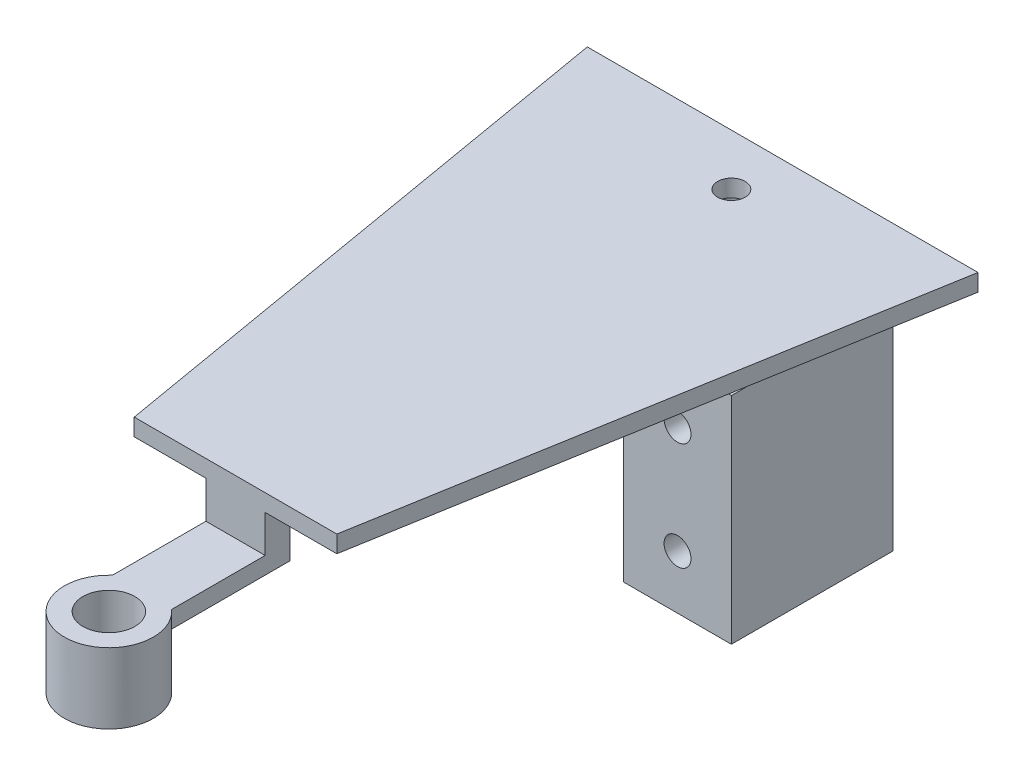
ISO-10303-21;
HEADER;
FILE_DESCRIPTION(('STEP AP214'),'2;1');
FILE_NAME('part.step','',(''),(''),'','','');
FILE_SCHEMA(('AUTOMOTIVE_DESIGN { 1 0 10303 214 1 1 1 1 }'));
ENDSEC;
DATA;
#1=APPLICATION_CONTEXT('core data for automotive mechanical design processes');
#2=APPLICATION_PROTOCOL_DEFINITION('international standard','automotive_design',2000,#1);
#3=PRODUCT_CONTEXT('',#1,'mechanical');
#4=PRODUCT('Part','Part','',(#3));
#5=PRODUCT_RELATED_PRODUCT_CATEGORY('part','',(#4));
#6=PRODUCT_DEFINITION_FORMATION('','',#4);
#7=PRODUCT_DEFINITION_CONTEXT('part definition',#1,'design');
#8=PRODUCT_DEFINITION('design','',#6,#7);
#9=PRODUCT_DEFINITION_SHAPE('','',#8);
#10=(LENGTH_UNIT() NAMED_UNIT(*) SI_UNIT(.MILLI.,.METRE.));
#11=(NAMED_UNIT(*) PLANE_ANGLE_UNIT() SI_UNIT($,.RADIAN.));
#12=(NAMED_UNIT(*) SI_UNIT($,.STERADIAN.) SOLID_ANGLE_UNIT());
#13=UNCERTAINTY_MEASURE_WITH_UNIT(LENGTH_MEASURE(1.E-05),#10,'distance_accuracy_value','');
#14=(GEOMETRIC_REPRESENTATION_CONTEXT(3) GLOBAL_UNCERTAINTY_ASSIGNED_CONTEXT((#13)) GLOBAL_UNIT_ASSIGNED_CONTEXT((#10,
#11,#12)) REPRESENTATION_CONTEXT('',''));
#15=CARTESIAN_POINT('',(0.,0.,0.));
#16=DIRECTION('',(0.,0.,1.));
#17=DIRECTION('',(1.,0.,0.));
#18=AXIS2_PLACEMENT_3D('',#15,#16,#17);
#19=CARTESIAN_POINT('',(10.,53.081,105.6));
#20=DIRECTION('',(0.,1.,0.));
#21=DIRECTION('',(0.,0.,1.));
#22=AXIS2_PLACEMENT_3D('',#19,#20,#21);
#23=PLANE('',#22);
#24=DIRECTION('',(1.,0.,0.));
#25=VECTOR('',#24,1.);
#26=CARTESIAN_POINT('',(4.5,53.081,82.075));
#27=LINE('',#26,#25);
#28=CARTESIAN_POINT('',(4.50000000000001,53.081,82.075));
#29=VERTEX_POINT('',#28);
#30=CARTESIAN_POINT('',(15.5,53.081,82.075));
#31=VERTEX_POINT('',#30);
#32=EDGE_CURVE('E64',#29,#31,#27,.T.);
#33=ORIENTED_EDGE('',*,*,#32,.F.);
#34=DIRECTION('',(0.,0.,1.));
#35=VECTOR('',#34,1.);
#36=CARTESIAN_POINT('',(4.50000000000001,53.081,99.4441064824024));
#37=LINE('',#36,#35);
#38=CARTESIAN_POINT('',(4.50000000000001,53.081,99.4441064824024));
#39=VERTEX_POINT('',#38);
#40=EDGE_CURVE('E68',#29,#39,#37,.T.);
#41=ORIENTED_EDGE('',*,*,#40,.T.);
#42=CARTESIAN_POINT('',(10.,53.081,105.6));
#43=DIRECTION('',(0.,1.,0.));
#44=DIRECTION('',(0.,0.,1.));
#45=AXIS2_PLACEMENT_3D('',#42,#43,#44);
#46=CIRCLE('',#45,8.255);
#47=CARTESIAN_POINT('',(15.5,53.081,99.4441064824024));
#48=VERTEX_POINT('',#47);
#49=EDGE_CURVE('E57',#39,#48,#46,.T.);
#50=ORIENTED_EDGE('',*,*,#49,.T.);
#51=DIRECTION('',(0.,0.,-1.));
#52=VECTOR('',#51,1.);
#53=CARTESIAN_POINT('',(15.5,53.081,99.4441064824024));
#54=LINE('',#53,#52);
#55=EDGE_CURVE('E192',#48,#31,#54,.T.);
#56=ORIENTED_EDGE('',*,*,#55,.T.);
#57=EDGE_LOOP('',(#33,#41,#50,#56));
#58=FACE_BOUND('',#57,.T.);
#59=CARTESIAN_POINT('',(10.,53.081,105.6));
#60=DIRECTION('',(0.,1.,0.));
#61=DIRECTION('',(0.,0.,1.));
#62=AXIS2_PLACEMENT_3D('',#59,#60,#61);
#63=CIRCLE('',#62,4.82599999999999);
#64=CARTESIAN_POINT('',(10.,53.081,110.426));
#65=VERTEX_POINT('',#64);
#66=EDGE_CURVE('E211',#65,#65,#63,.T.);
#67=ORIENTED_EDGE('',*,*,#66,.F.);
#68=EDGE_LOOP('',(#67));
#69=FACE_BOUND('',#68,.T.);
#70=ADVANCED_FACE('F49',(#58,#69),#23,.T.);
#71=CARTESIAN_POINT('',(10.,40.,105.6));
#72=DIRECTION('',(0.,1.,0.));
#73=DIRECTION('',(0.,0.,1.));
#74=AXIS2_PLACEMENT_3D('',#71,#72,#73);
#75=PLANE('',#74);
#76=CARTESIAN_POINT('',(10.,40.,105.6));
#77=DIRECTION('',(0.,1.,0.));
#78=DIRECTION('',(0.,0.,1.));
#79=AXIS2_PLACEMENT_3D('',#76,#77,#78);
#80=CIRCLE('',#79,8.255);
#81=CARTESIAN_POINT('',(10.,40.,113.855));
#82=VERTEX_POINT('',#81);
#83=EDGE_CURVE('E214',#82,#82,#80,.T.);
#84=ORIENTED_EDGE('',*,*,#83,.F.);
#85=EDGE_LOOP('',(#84));
#86=FACE_BOUND('',#85,.T.);
#87=CARTESIAN_POINT('',(10.,40.,105.6));
#88=DIRECTION('',(0.,1.,0.));
#89=DIRECTION('',(0.,0.,1.));
#90=AXIS2_PLACEMENT_3D('',#87,#88,#89);
#91=CIRCLE('',#90,4.82599999999999);
#92=CARTESIAN_POINT('',(10.,40.,110.426));
#93=VERTEX_POINT('',#92);
#94=EDGE_CURVE('E203',#93,#93,#91,.T.);
#95=ORIENTED_EDGE('',*,*,#94,.T.);
#96=EDGE_LOOP('',(#95));
#97=FACE_BOUND('',#96,.T.);
#98=ADVANCED_FACE('F221',(#86,#97),#75,.F.);
#99=CARTESIAN_POINT('',(10.,53.081,105.6));
#100=DIRECTION('',(0.,-1.,0.));
#101=DIRECTION('',(0.,0.,-1.));
#102=AXIS2_PLACEMENT_3D('',#99,#100,#101);
#103=CYLINDRICAL_SURFACE('',#102,8.255);
#104=ORIENTED_EDGE('',*,*,#49,.F.);
#105=DIRECTION('',(0.,1.,0.));
#106=VECTOR('',#105,1.);
#107=CARTESIAN_POINT('',(4.50000000000001,49.906,99.4441064824024));
#108=LINE('',#107,#106);
#109=CARTESIAN_POINT('',(4.50000000000001,49.906,99.4441064824024));
#110=VERTEX_POINT('',#109);
#111=EDGE_CURVE('E198',#110,#39,#108,.T.);
#112=ORIENTED_EDGE('',*,*,#111,.F.);
#113=CARTESIAN_POINT('',(10.,49.906,105.6));
#114=DIRECTION('',(0.,-1.,0.));
#115=DIRECTION('',(0.,0.,-1.));
#116=AXIS2_PLACEMENT_3D('',#113,#114,#115);
#117=CIRCLE('',#116,8.255);
#118=CARTESIAN_POINT('',(15.5,49.906,99.4441064824024));
#119=VERTEX_POINT('',#118);
#120=EDGE_CURVE('E12',#110,#119,#117,.T.);
#121=ORIENTED_EDGE('',*,*,#120,.T.);
#122=DIRECTION('',(0.,1.,0.));
#123=VECTOR('',#122,1.);
#124=CARTESIAN_POINT('',(15.5,49.906,99.4441064824024));
#125=LINE('',#124,#123);
#126=EDGE_CURVE('E207',#119,#48,#125,.T.);
#127=ORIENTED_EDGE('',*,*,#126,.T.);
#128=EDGE_LOOP('',(#104,#112,#121,#127));
#129=FACE_BOUND('',#128,.T.);
#130=ORIENTED_EDGE('',*,*,#83,.T.);
#131=EDGE_LOOP('',(#130));
#132=FACE_BOUND('',#131,.T.);
#133=ADVANCED_FACE('F51',(#129,#132),#103,.T.);
#134=CARTESIAN_POINT('',(10.,53.081,105.6));
#135=DIRECTION('',(0.,-1.,0.));
#136=DIRECTION('',(0.,0.,-1.));
#137=AXIS2_PLACEMENT_3D('',#134,#135,#136);
#138=CYLINDRICAL_SURFACE('',#137,4.82599999999999);
#139=ORIENTED_EDGE('',*,*,#66,.T.);
#140=EDGE_LOOP('',(#139));
#141=FACE_BOUND('',#140,.T.);
#142=ORIENTED_EDGE('',*,*,#94,.F.);
#143=EDGE_LOOP('',(#142));
#144=FACE_BOUND('',#143,.T.);
#145=ADVANCED_FACE('F226',(#141,#144),#138,.F.);
#146=CARTESIAN_POINT('',(4.50000000000001,49.906,99.4441064824024));
#147=DIRECTION('',(-1.,0.,0.));
#148=DIRECTION('',(0.,0.,1.));
#149=AXIS2_PLACEMENT_3D('',#146,#147,#148);
#150=PLANE('',#149);
#151=ORIENTED_EDGE('',*,*,#40,.F.);
#152=DIRECTION('',(0.,-1.,0.));
#153=VECTOR('',#152,1.);
#154=CARTESIAN_POINT('',(4.5,71.9350397892645,82.075));
#155=LINE('',#154,#153);
#156=CARTESIAN_POINT('',(4.5,60.,82.075));
#157=VERTEX_POINT('',#156);
#158=EDGE_CURVE('E135',#157,#29,#155,.T.);
#159=ORIENTED_EDGE('',*,*,#158,.F.);
#160=DIRECTION('',(0.,0.,1.));
#161=VECTOR('',#160,1.);
#162=CARTESIAN_POINT('',(4.50000000000001,60.,77.4441064824024));
#163=LINE('',#162,#161);
#164=CARTESIAN_POINT('',(4.50000000000001,60.,77.4441064824024));
#165=VERTEX_POINT('',#164);
#166=EDGE_CURVE('E178',#165,#157,#163,.T.);
#167=ORIENTED_EDGE('',*,*,#166,.F.);
#168=DIRECTION('',(0.,1.,0.));
#169=VECTOR('',#168,1.);
#170=CARTESIAN_POINT('',(4.50000000000001,49.906,77.4441064824024));
#171=LINE('',#170,#169);
#172=CARTESIAN_POINT('',(4.50000000000001,49.906,77.4441064824024));
#173=VERTEX_POINT('',#172);
#174=EDGE_CURVE('E201',#173,#165,#171,.T.);
#175=ORIENTED_EDGE('',*,*,#174,.F.);
#176=DIRECTION('',(0.,0.,1.));
#177=VECTOR('',#176,1.);
#178=CARTESIAN_POINT('',(4.50000000000001,49.906,99.4441064824024));
#179=LINE('',#178,#177);
#180=EDGE_CURVE('E188',#173,#110,#179,.T.);
#181=ORIENTED_EDGE('',*,*,#180,.T.);
#182=ORIENTED_EDGE('',*,*,#111,.T.);
#183=EDGE_LOOP('',(#151,#159,#167,#175,#181,#182));
#184=FACE_BOUND('',#183,.T.);
#185=ADVANCED_FACE('F228',(#184),#150,.T.);
#186=CARTESIAN_POINT('',(4.50000000000001,49.906,77.4441064824024));
#187=DIRECTION('',(0.,0.,-1.));
#188=DIRECTION('',(-1.,0.,0.));
#189=AXIS2_PLACEMENT_3D('',#186,#187,#188);
#190=PLANE('',#189);
#191=ORIENTED_EDGE('',*,*,#174,.T.);
#192=DIRECTION('',(-1.,0.,0.));
#193=VECTOR('',#192,1.);
#194=CARTESIAN_POINT('',(15.5,60.,77.4441064824024));
#195=LINE('',#194,#193);
#196=CARTESIAN_POINT('',(15.5,60.,77.4441064824024));
#197=VERTEX_POINT('',#196);
#198=EDGE_CURVE('E181',#197,#165,#195,.T.);
#199=ORIENTED_EDGE('',*,*,#198,.F.);
#200=DIRECTION('',(0.,1.,0.));
#201=VECTOR('',#200,1.);
#202=CARTESIAN_POINT('',(15.5,49.906,77.4441064824024));
#203=LINE('',#202,#201);
#204=CARTESIAN_POINT('',(15.5,49.906,77.4441064824024));
#205=VERTEX_POINT('',#204);
#206=EDGE_CURVE('E204',#205,#197,#203,.T.);
#207=ORIENTED_EDGE('',*,*,#206,.F.);
#208=DIRECTION('',(-1.,0.,0.));
#209=VECTOR('',#208,1.);
#210=CARTESIAN_POINT('',(4.50000000000001,49.906,77.4441064824024));
#211=LINE('',#210,#209);
#212=EDGE_CURVE('E195',#205,#173,#211,.T.);
#213=ORIENTED_EDGE('',*,*,#212,.T.);
#214=EDGE_LOOP('',(#191,#199,#207,#213));
#215=FACE_BOUND('',#214,.T.);
#216=ADVANCED_FACE('F235',(#215),#190,.T.);
#217=CARTESIAN_POINT('',(15.5,49.906,99.4441064824024));
#218=DIRECTION('',(1.,0.,0.));
#219=DIRECTION('',(0.,0.,-1.));
#220=AXIS2_PLACEMENT_3D('',#217,#218,#219);
#221=PLANE('',#220);
#222=ORIENTED_EDGE('',*,*,#55,.F.);
#223=ORIENTED_EDGE('',*,*,#126,.F.);
#224=DIRECTION('',(0.,0.,-1.));
#225=VECTOR('',#224,1.);
#226=CARTESIAN_POINT('',(15.5,49.906,99.4441064824024));
#227=LINE('',#226,#225);
#228=EDGE_CURVE('E191',#119,#205,#227,.T.);
#229=ORIENTED_EDGE('',*,*,#228,.T.);
#230=ORIENTED_EDGE('',*,*,#206,.T.);
#231=DIRECTION('',(0.,0.,-1.));
#232=VECTOR('',#231,1.);
#233=CARTESIAN_POINT('',(15.5,60.,82.075));
#234=LINE('',#233,#232);
#235=CARTESIAN_POINT('',(15.5,60.,82.075));
#236=VERTEX_POINT('',#235);
#237=EDGE_CURVE('E175',#236,#197,#234,.T.);
#238=ORIENTED_EDGE('',*,*,#237,.F.);
#239=DIRECTION('',(0.,-1.,0.));
#240=VECTOR('',#239,1.);
#241=CARTESIAN_POINT('',(15.5,71.9350397892645,82.075));
#242=LINE('',#241,#240);
#243=EDGE_CURVE('E174',#236,#31,#242,.T.);
#244=ORIENTED_EDGE('',*,*,#243,.T.);
#245=EDGE_LOOP('',(#222,#223,#229,#230,#238,#244));
#246=FACE_BOUND('',#245,.T.);
#247=ADVANCED_FACE('F276',(#246),#221,.T.);
#248=CARTESIAN_POINT('',(0.,49.906,0.));
#249=DIRECTION('',(0.,-1.,0.));
#250=DIRECTION('',(0.,0.,-1.));
#251=AXIS2_PLACEMENT_3D('',#248,#249,#250);
#252=PLANE('',#251);
#253=ORIENTED_EDGE('',*,*,#120,.F.);
#254=ORIENTED_EDGE('',*,*,#180,.F.);
#255=ORIENTED_EDGE('',*,*,#212,.F.);
#256=ORIENTED_EDGE('',*,*,#228,.F.);
#257=EDGE_LOOP('',(#253,#254,#255,#256));
#258=FACE_BOUND('',#257,.T.);
#259=ADVANCED_FACE('F271',(#258),#252,.T.);
#260=CARTESIAN_POINT('',(4.5,71.9350397892645,82.075));
#261=DIRECTION('',(0.,0.,-1.));
#262=DIRECTION('',(-1.,0.,0.));
#263=AXIS2_PLACEMENT_3D('',#260,#261,#262);
#264=PLANE('',#263);
#265=ORIENTED_EDGE('',*,*,#243,.F.);
#266=DIRECTION('',(1.,0.,0.));
#267=VECTOR('',#266,1.);
#268=CARTESIAN_POINT('',(0.,60.,82.075));
#269=LINE('',#268,#267);
#270=CARTESIAN_POINT('',(28.8104029614294,60.,82.075));
#271=VERTEX_POINT('',#270);
#272=EDGE_CURVE('E153',#236,#271,#269,.T.);
#273=ORIENTED_EDGE('',*,*,#272,.T.);
#274=DIRECTION('',(0.,-1.,0.));
#275=VECTOR('',#274,1.);
#276=CARTESIAN_POINT('',(28.8104029614294,63.175,82.075));
#277=LINE('',#276,#275);
#278=CARTESIAN_POINT('',(28.8104029614294,63.175,82.075));
#279=VERTEX_POINT('',#278);
#280=EDGE_CURVE('E161',#279,#271,#277,.T.);
#281=ORIENTED_EDGE('',*,*,#280,.F.);
#282=DIRECTION('',(1.,0.,0.));
#283=VECTOR('',#282,1.);
#284=CARTESIAN_POINT('',(0.,63.175,82.075));
#285=LINE('',#284,#283);
#286=CARTESIAN_POINT('',(-8.8104029614294,63.175,82.075));
#287=VERTEX_POINT('',#286);
#288=EDGE_CURVE('E148',#287,#279,#285,.T.);
#289=ORIENTED_EDGE('',*,*,#288,.F.);
#290=DIRECTION('',(0.,-1.,0.));
#291=VECTOR('',#290,1.);
#292=CARTESIAN_POINT('',(-8.8104029614294,63.175,82.075));
#293=LINE('',#292,#291);
#294=CARTESIAN_POINT('',(-8.8104029614294,60.,82.075));
#295=VERTEX_POINT('',#294);
#296=EDGE_CURVE('E169',#287,#295,#293,.T.);
#297=ORIENTED_EDGE('',*,*,#296,.T.);
#298=EDGE_CURVE('E150',#295,#157,#269,.T.);
#299=ORIENTED_EDGE('',*,*,#298,.T.);
#300=ORIENTED_EDGE('',*,*,#158,.T.);
#301=ORIENTED_EDGE('',*,*,#32,.T.);
#302=EDGE_LOOP('',(#265,#273,#281,#289,#297,#299,#300,#301));
#303=FACE_BOUND('',#302,.T.);
#304=ADVANCED_FACE('F275',(#303),#264,.F.);
#305=CARTESIAN_POINT('',(0.,60.,0.));
#306=DIRECTION('',(0.,1.,0.));
#307=DIRECTION('',(0.,0.,1.));
#308=AXIS2_PLACEMENT_3D('',#305,#306,#307);
#309=PLANE('',#308);
#310=CARTESIAN_POINT('',(10.,60.,-10.));
#311=DIRECTION('',(0.,1.,0.));
#312=DIRECTION('',(0.,0.,1.));
#313=AXIS2_PLACEMENT_3D('',#310,#311,#312);
#314=CIRCLE('',#313,2.5527);
#315=CARTESIAN_POINT('',(10.,60.,-7.4473));
#316=VERTEX_POINT('',#315);
#317=EDGE_CURVE('E164',#316,#316,#314,.T.);
#318=ORIENTED_EDGE('',*,*,#317,.T.);
#319=EDGE_LOOP('',(#318));
#320=FACE_BOUND('',#319,.T.);
#321=ORIENTED_EDGE('',*,*,#198,.T.);
#322=ORIENTED_EDGE('',*,*,#166,.T.);
#323=ORIENTED_EDGE('',*,*,#298,.F.);
#324=DIRECTION('',(0.169399207883059,0.,0.985547517052624));
#325=VECTOR('',#324,1.);
#326=CARTESIAN_POINT('',(-22.2600795884186,60.,3.82613702987048));
#327=LINE('',#326,#325);
#328=CARTESIAN_POINT('',(-26.2737512253363,60.,-19.525));
#329=VERTEX_POINT('',#328);
#330=EDGE_CURVE('E166',#329,#295,#327,.T.);
#331=ORIENTED_EDGE('',*,*,#330,.F.);
#332=DIRECTION('',(-1.,0.,0.));
#333=VECTOR('',#332,1.);
#334=CARTESIAN_POINT('',(0.,60.,-19.525));
#335=LINE('',#334,#333);
#336=CARTESIAN_POINT('',(46.2737512253363,60.,-19.525));
#337=VERTEX_POINT('',#336);
#338=EDGE_CURVE('E163',#337,#329,#335,.T.);
#339=ORIENTED_EDGE('',*,*,#338,.F.);
#340=DIRECTION('',(-0.169399207883058,0.,0.985547517052624));
#341=VECTOR('',#340,1.);
#342=CARTESIAN_POINT('',(41.6861577557905,60.,7.16515640426706));
#343=LINE('',#342,#341);
#344=EDGE_CURVE('E132',#337,#271,#343,.T.);
#345=ORIENTED_EDGE('',*,*,#344,.T.);
#346=ORIENTED_EDGE('',*,*,#272,.F.);
#347=ORIENTED_EDGE('',*,*,#237,.T.);
#348=EDGE_LOOP('',(#321,#322,#323,#331,#339,#345,#346,#347));
#349=FACE_BOUND('',#348,.T.);
#350=ADVANCED_FACE('F310',(#320,#349),#309,.F.);
#351=CARTESIAN_POINT('',(41.6861577557905,63.175,7.16515640426706));
#352=DIRECTION('',(0.985547517052624,0.,0.169399207883058));
#353=DIRECTION('',(0.169399207883058,0.,-0.985547517052624));
#354=AXIS2_PLACEMENT_3D('',#351,#352,#353);
#355=PLANE('',#354);
#356=ORIENTED_EDGE('',*,*,#344,.F.);
#357=DIRECTION('',(0.,-1.,0.));
#358=VECTOR('',#357,1.);
#359=CARTESIAN_POINT('',(46.2737512253363,63.175,-19.525));
#360=LINE('',#359,#358);
#361=CARTESIAN_POINT('',(46.2737512253363,63.175,-19.525));
#362=VERTEX_POINT('',#361);
#363=EDGE_CURVE('E125',#362,#337,#360,.T.);
#364=ORIENTED_EDGE('',*,*,#363,.F.);
#365=DIRECTION('',(-0.169399207883058,0.,0.985547517052624));
#366=VECTOR('',#365,1.);
#367=CARTESIAN_POINT('',(41.6861577557905,63.175,7.16515640426706));
#368=LINE('',#367,#366);
#369=EDGE_CURVE('E130',#362,#279,#368,.T.);
#370=ORIENTED_EDGE('',*,*,#369,.T.);
#371=ORIENTED_EDGE('',*,*,#280,.T.);
#372=EDGE_LOOP('',(#356,#364,#370,#371));
#373=FACE_BOUND('',#372,.T.);
#374=ADVANCED_FACE('F127',(#373),#355,.T.);
#375=CARTESIAN_POINT('',(0.,63.175,-19.525));
#376=DIRECTION('',(0.,0.,1.));
#377=DIRECTION('',(1.,0.,0.));
#378=AXIS2_PLACEMENT_3D('',#375,#376,#377);
#379=PLANE('',#378);
#380=ORIENTED_EDGE('',*,*,#338,.T.);
#381=DIRECTION('',(0.,-1.,0.));
#382=VECTOR('',#381,1.);
#383=CARTESIAN_POINT('',(-26.2737512253363,63.175,-19.525));
#384=LINE('',#383,#382);
#385=CARTESIAN_POINT('',(-26.2737512253363,63.175,-19.525));
#386=VERTEX_POINT('',#385);
#387=EDGE_CURVE('E136',#386,#329,#384,.T.);
#388=ORIENTED_EDGE('',*,*,#387,.F.);
#389=DIRECTION('',(-1.,0.,0.));
#390=VECTOR('',#389,1.);
#391=CARTESIAN_POINT('',(0.,63.175,-19.525));
#392=LINE('',#391,#390);
#393=EDGE_CURVE('E139',#362,#386,#392,.T.);
#394=ORIENTED_EDGE('',*,*,#393,.F.);
#395=ORIENTED_EDGE('',*,*,#363,.T.);
#396=EDGE_LOOP('',(#380,#388,#394,#395));
#397=FACE_BOUND('',#396,.T.);
#398=ADVANCED_FACE('F140',(#397),#379,.F.);
#399=CARTESIAN_POINT('',(-22.2600795884186,63.175,3.82613702987048));
#400=DIRECTION('',(0.985547517052624,0.,-0.169399207883059));
#401=DIRECTION('',(-0.169399207883059,0.,-0.985547517052624));
#402=AXIS2_PLACEMENT_3D('',#399,#400,#401);
#403=PLANE('',#402);
#404=ORIENTED_EDGE('',*,*,#330,.T.);
#405=ORIENTED_EDGE('',*,*,#296,.F.);
#406=DIRECTION('',(0.169399207883059,0.,0.985547517052624));
#407=VECTOR('',#406,1.);
#408=CARTESIAN_POINT('',(-22.2600795884186,63.175,3.82613702987048));
#409=LINE('',#408,#407);
#410=EDGE_CURVE('E144',#386,#287,#409,.T.);
#411=ORIENTED_EDGE('',*,*,#410,.F.);
#412=ORIENTED_EDGE('',*,*,#387,.T.);
#413=EDGE_LOOP('',(#404,#405,#411,#412));
#414=FACE_BOUND('',#413,.T.);
#415=ADVANCED_FACE('F331',(#414),#403,.F.);
#416=CARTESIAN_POINT('',(0.,63.175,0.));
#417=DIRECTION('',(0.,1.,0.));
#418=DIRECTION('',(0.,0.,1.));
#419=AXIS2_PLACEMENT_3D('',#416,#417,#418);
#420=PLANE('',#419);
#421=CARTESIAN_POINT('',(10.,63.175,-10.));
#422=DIRECTION('',(0.,1.,0.));
#423=DIRECTION('',(0.,0.,1.));
#424=AXIS2_PLACEMENT_3D('',#421,#422,#423);
#425=CIRCLE('',#424,2.5527);
#426=CARTESIAN_POINT('',(10.,63.175,-7.4473));
#427=VERTEX_POINT('',#426);
#428=EDGE_CURVE('E156',#427,#427,#425,.T.);
#429=ORIENTED_EDGE('',*,*,#428,.F.);
#430=EDGE_LOOP('',(#429));
#431=FACE_BOUND('',#430,.T.);
#432=ORIENTED_EDGE('',*,*,#369,.F.);
#433=ORIENTED_EDGE('',*,*,#393,.T.);
#434=ORIENTED_EDGE('',*,*,#410,.T.);
#435=ORIENTED_EDGE('',*,*,#288,.T.);
#436=EDGE_LOOP('',(#432,#433,#434,#435));
#437=FACE_BOUND('',#436,.T.);
#438=ADVANCED_FACE('F146',(#431,#437),#420,.T.);
#439=CARTESIAN_POINT('',(10.,60.,-10.));
#440=DIRECTION('',(0.,1.,0.));
#441=DIRECTION('',(0.,0.,1.));
#442=AXIS2_PLACEMENT_3D('',#439,#440,#441);
#443=CYLINDRICAL_SURFACE('',#442,2.5527);
#444=ORIENTED_EDGE('',*,*,#317,.F.);
#445=EDGE_LOOP('',(#444));
#446=FACE_BOUND('',#445,.T.);
#447=ORIENTED_EDGE('',*,*,#428,.T.);
#448=EDGE_LOOP('',(#447));
#449=FACE_BOUND('',#448,.T.);
#450=ADVANCED_FACE('F354',(#446,#449),#443,.F.);
#451=CLOSED_SHELL('',(#70,#98,#133,#145,#185,#216,#247,#259,#304,#350,#374,#398,#415,#438,#450));
#452=MANIFOLD_SOLID_BREP('B2',#451);
#453=CARTESIAN_POINT('',(0.,0.,-30.));
#454=DIRECTION('',(-1.,0.,0.));
#455=DIRECTION('',(0.,0.,1.));
#456=AXIS2_PLACEMENT_3D('',#453,#454,#455);
#457=PLANE('',#456);
#458=DIRECTION('',(0.,-1.,0.));
#459=VECTOR('',#458,1.);
#460=CARTESIAN_POINT('',(0.,0.,0.));
#461=LINE('',#460,#459);
#462=CARTESIAN_POINT('',(0.,40.,0.));
#463=VERTEX_POINT('',#462);
#464=CARTESIAN_POINT('',(0.,0.,0.));
#465=VERTEX_POINT('',#464);
#466=EDGE_CURVE('E476',#463,#465,#461,.T.);
#467=ORIENTED_EDGE('',*,*,#466,.F.);
#468=DIRECTION('',(0.,0.,1.));
#469=VECTOR('',#468,1.);
#470=CARTESIAN_POINT('',(0.,40.,-30.));
#471=LINE('',#470,#469);
#472=CARTESIAN_POINT('',(0.,40.,-30.));
#473=VERTEX_POINT('',#472);
#474=EDGE_CURVE('E418',#473,#463,#471,.T.);
#475=ORIENTED_EDGE('',*,*,#474,.F.);
#476=DIRECTION('',(0.,-1.,0.));
#477=VECTOR('',#476,1.);
#478=CARTESIAN_POINT('',(0.,0.,-30.));
#479=LINE('',#478,#477);
#480=CARTESIAN_POINT('',(0.,0.,-30.));
#481=VERTEX_POINT('',#480);
#482=EDGE_CURVE('E469',#473,#481,#479,.T.);
#483=ORIENTED_EDGE('',*,*,#482,.T.);
#484=DIRECTION('',(0.,0.,1.));
#485=VECTOR('',#484,1.);
#486=CARTESIAN_POINT('',(0.,0.,-30.));
#487=LINE('',#486,#485);
#488=EDGE_CURVE('E412',#481,#465,#487,.T.);
#489=ORIENTED_EDGE('',*,*,#488,.T.);
#490=EDGE_LOOP('',(#467,#475,#483,#489));
#491=FACE_BOUND('',#490,.T.);
#492=ADVANCED_FACE('F409',(#491),#457,.T.);
#493=CARTESIAN_POINT('',(0.,40.,-30.));
#494=DIRECTION('',(0.,1.,0.));
#495=DIRECTION('',(0.,0.,1.));
#496=AXIS2_PLACEMENT_3D('',#493,#494,#495);
#497=PLANE('',#496);
#498=CARTESIAN_POINT('',(10.,40.,-10.));
#499=DIRECTION('',(0.,1.,0.));
#500=DIRECTION('',(0.,0.,1.));
#501=AXIS2_PLACEMENT_3D('',#498,#499,#500);
#502=CIRCLE('',#501,9.52500000000001);
#503=CARTESIAN_POINT('',(10.,40.,-0.474999999999993));
#504=VERTEX_POINT('',#503);
#505=EDGE_CURVE('E47',#504,#504,#502,.T.);
#506=ORIENTED_EDGE('',*,*,#505,.F.);
#507=EDGE_LOOP('',(#506));
#508=FACE_BOUND('',#507,.T.);
#509=DIRECTION('',(-1.,0.,0.));
#510=VECTOR('',#509,1.);
#511=CARTESIAN_POINT('',(0.,40.,0.));
#512=LINE('',#511,#510);
#513=CARTESIAN_POINT('',(20.,40.,0.));
#514=VERTEX_POINT('',#513);
#515=EDGE_CURVE('E471',#514,#463,#512,.T.);
#516=ORIENTED_EDGE('',*,*,#515,.F.);
#517=DIRECTION('',(0.,0.,1.));
#518=VECTOR('',#517,1.);
#519=CARTESIAN_POINT('',(20.,40.,-30.));
#520=LINE('',#519,#518);
#521=CARTESIAN_POINT('',(20.,40.,-30.));
#522=VERTEX_POINT('',#521);
#523=EDGE_CURVE('E443',#522,#514,#520,.T.);
#524=ORIENTED_EDGE('',*,*,#523,.F.);
#525=DIRECTION('',(-1.,0.,0.));
#526=VECTOR('',#525,1.);
#527=CARTESIAN_POINT('',(0.,40.,-30.));
#528=LINE('',#527,#526);
#529=EDGE_CURVE('E466',#522,#473,#528,.T.);
#530=ORIENTED_EDGE('',*,*,#529,.T.);
#531=ORIENTED_EDGE('',*,*,#474,.T.);
#532=EDGE_LOOP('',(#516,#524,#530,#531));
#533=FACE_BOUND('',#532,.T.);
#534=ADVANCED_FACE('F488',(#508,#533),#497,.T.);
#535=CARTESIAN_POINT('',(20.,0.,-30.));
#536=DIRECTION('',(1.,0.,0.));
#537=DIRECTION('',(0.,1.,0.));
#538=AXIS2_PLACEMENT_3D('',#535,#536,#537);
#539=PLANE('',#538);
#540=DIRECTION('',(0.,1.,0.));
#541=VECTOR('',#540,1.);
#542=CARTESIAN_POINT('',(20.,0.,0.));
#543=LINE('',#542,#541);
#544=CARTESIAN_POINT('',(20.,0.,0.));
#545=VERTEX_POINT('',#544);
#546=EDGE_CURVE('E461',#545,#514,#543,.T.);
#547=ORIENTED_EDGE('',*,*,#546,.F.);
#548=DIRECTION('',(0.,0.,1.));
#549=VECTOR('',#548,1.);
#550=CARTESIAN_POINT('',(20.,0.,-30.));
#551=LINE('',#550,#549);
#552=CARTESIAN_POINT('',(20.,0.,-30.));
#553=VERTEX_POINT('',#552);
#554=EDGE_CURVE('E456',#553,#545,#551,.T.);
#555=ORIENTED_EDGE('',*,*,#554,.F.);
#556=DIRECTION('',(0.,1.,0.));
#557=VECTOR('',#556,1.);
#558=CARTESIAN_POINT('',(20.,0.,-30.));
#559=LINE('',#558,#557);
#560=EDGE_CURVE('E459',#553,#522,#559,.T.);
#561=ORIENTED_EDGE('',*,*,#560,.T.);
#562=ORIENTED_EDGE('',*,*,#523,.T.);
#563=EDGE_LOOP('',(#547,#555,#561,#562));
#564=FACE_BOUND('',#563,.T.);
#565=ADVANCED_FACE('F458',(#564),#539,.T.);
#566=CARTESIAN_POINT('',(0.,0.,-30.));
#567=DIRECTION('',(0.,-1.,0.));
#568=DIRECTION('',(1.,0.,0.));
#569=AXIS2_PLACEMENT_3D('',#566,#567,#568);
#570=PLANE('',#569);
#571=DIRECTION('',(1.,0.,0.));
#572=VECTOR('',#571,1.);
#573=CARTESIAN_POINT('',(0.,0.,0.));
#574=LINE('',#573,#572);
#575=EDGE_CURVE('E479',#465,#545,#574,.T.);
#576=ORIENTED_EDGE('',*,*,#575,.F.);
#577=ORIENTED_EDGE('',*,*,#488,.F.);
#578=DIRECTION('',(1.,0.,0.));
#579=VECTOR('',#578,1.);
#580=CARTESIAN_POINT('',(0.,0.,-30.));
#581=LINE('',#580,#579);
#582=EDGE_CURVE('E465',#481,#553,#581,.T.);
#583=ORIENTED_EDGE('',*,*,#582,.T.);
#584=ORIENTED_EDGE('',*,*,#554,.T.);
#585=EDGE_LOOP('',(#576,#577,#583,#584));
#586=FACE_BOUND('',#585,.T.);
#587=ADVANCED_FACE('F468',(#586),#570,.T.);
#588=CARTESIAN_POINT('',(0.,0.,-30.));
#589=DIRECTION('',(0.,0.,-1.));
#590=DIRECTION('',(-1.,0.,0.));
#591=AXIS2_PLACEMENT_3D('',#588,#589,#590);
#592=PLANE('',#591);
#593=CARTESIAN_POINT('',(10.,10.,-30.));
#594=DIRECTION('',(0.,0.,1.));
#595=DIRECTION('',(1.,0.,0.));
#596=AXIS2_PLACEMENT_3D('',#593,#594,#595);
#597=CIRCLE('',#596,2.5);
#598=CARTESIAN_POINT('',(12.5,10.,-30.));
#599=VERTEX_POINT('',#598);
#600=EDGE_CURVE('E549',#599,#599,#597,.T.);
#601=ORIENTED_EDGE('',*,*,#600,.T.);
#602=EDGE_LOOP('',(#601));
#603=FACE_BOUND('',#602,.T.);
#604=CARTESIAN_POINT('',(10.,30.,-30.));
#605=DIRECTION('',(0.,0.,1.));
#606=DIRECTION('',(1.,0.,0.));
#607=AXIS2_PLACEMENT_3D('',#604,#605,#606);
#608=CIRCLE('',#607,2.49999999999999);
#609=CARTESIAN_POINT('',(12.5,30.,-30.));
#610=VERTEX_POINT('',#609);
#611=EDGE_CURVE('E480',#610,#610,#608,.T.);
#612=ORIENTED_EDGE('',*,*,#611,.T.);
#613=EDGE_LOOP('',(#612));
#614=FACE_BOUND('',#613,.T.);
#615=ORIENTED_EDGE('',*,*,#482,.F.);
#616=ORIENTED_EDGE('',*,*,#529,.F.);
#617=ORIENTED_EDGE('',*,*,#560,.F.);
#618=ORIENTED_EDGE('',*,*,#582,.F.);
#619=EDGE_LOOP('',(#615,#616,#617,#618));
#620=FACE_BOUND('',#619,.T.);
#621=ADVANCED_FACE('F464',(#603,#614,#620),#592,.T.);
#622=CARTESIAN_POINT('',(0.,0.,0.));
#623=DIRECTION('',(0.,0.,-1.));
#624=DIRECTION('',(-1.,0.,0.));
#625=AXIS2_PLACEMENT_3D('',#622,#623,#624);
#626=PLANE('',#625);
#627=CARTESIAN_POINT('',(10.,10.,0.));
#628=DIRECTION('',(0.,0.,1.));
#629=DIRECTION('',(1.,0.,0.));
#630=AXIS2_PLACEMENT_3D('',#627,#628,#629);
#631=CIRCLE('',#630,2.5);
#632=CARTESIAN_POINT('',(12.5,10.,0.));
#633=VERTEX_POINT('',#632);
#634=EDGE_CURVE('E544',#633,#633,#631,.T.);
#635=ORIENTED_EDGE('',*,*,#634,.F.);
#636=EDGE_LOOP('',(#635));
#637=FACE_BOUND('',#636,.T.);
#638=CARTESIAN_POINT('',(10.,30.,0.));
#639=DIRECTION('',(0.,0.,1.));
#640=DIRECTION('',(1.,0.,0.));
#641=AXIS2_PLACEMENT_3D('',#638,#639,#640);
#642=CIRCLE('',#641,2.49999999999999);
#643=CARTESIAN_POINT('',(12.5,30.,0.));
#644=VERTEX_POINT('',#643);
#645=EDGE_CURVE('E551',#644,#644,#642,.T.);
#646=ORIENTED_EDGE('',*,*,#645,.F.);
#647=EDGE_LOOP('',(#646));
#648=FACE_BOUND('',#647,.T.);
#649=ORIENTED_EDGE('',*,*,#466,.T.);
#650=ORIENTED_EDGE('',*,*,#575,.T.);
#651=ORIENTED_EDGE('',*,*,#546,.T.);
#652=ORIENTED_EDGE('',*,*,#515,.T.);
#653=EDGE_LOOP('',(#649,#650,#651,#652));
#654=FACE_BOUND('',#653,.T.);
#655=ADVANCED_FACE('F487',(#637,#648,#654),#626,.F.);
#656=CARTESIAN_POINT('',(10.,30.,-30.));
#657=DIRECTION('',(0.,0.,1.));
#658=DIRECTION('',(1.,0.,0.));
#659=AXIS2_PLACEMENT_3D('',#656,#657,#658);
#660=CYLINDRICAL_SURFACE('',#659,2.49999999999999);
#661=ORIENTED_EDGE('',*,*,#611,.F.);
#662=EDGE_LOOP('',(#661));
#663=FACE_BOUND('',#662,.T.);
#664=ORIENTED_EDGE('',*,*,#645,.T.);
#665=EDGE_LOOP('',(#664));
#666=FACE_BOUND('',#665,.T.);
#667=ADVANCED_FACE('F508',(#663,#666),#660,.F.);
#668=CARTESIAN_POINT('',(10.,10.,-30.));
#669=DIRECTION('',(0.,0.,1.));
#670=DIRECTION('',(1.,0.,0.));
#671=AXIS2_PLACEMENT_3D('',#668,#669,#670);
#672=CYLINDRICAL_SURFACE('',#671,2.5);
#673=ORIENTED_EDGE('',*,*,#600,.F.);
#674=EDGE_LOOP('',(#673));
#675=FACE_BOUND('',#674,.T.);
#676=ORIENTED_EDGE('',*,*,#634,.T.);
#677=EDGE_LOOP('',(#676));
#678=FACE_BOUND('',#677,.T.);
#679=ADVANCED_FACE('F515',(#675,#678),#672,.F.);
#680=CARTESIAN_POINT('',(10.,60.,-10.));
#681=DIRECTION('',(0.,-1.,0.));
#682=DIRECTION('',(0.,0.,-1.));
#683=AXIS2_PLACEMENT_3D('',#680,#681,#682);
#684=CYLINDRICAL_SURFACE('',#683,9.52500000000001);
#685=CARTESIAN_POINT('',(10.,60.,-10.));
#686=DIRECTION('',(0.,1.,0.));
#687=DIRECTION('',(0.,0.,1.));
#688=AXIS2_PLACEMENT_3D('',#685,#686,#687);
#689=CIRCLE('',#688,9.52500000000001);
#690=CARTESIAN_POINT('',(10.,60.,-0.474999999999993));
#691=VERTEX_POINT('',#690);
#692=EDGE_CURVE('E540',#691,#691,#689,.T.);
#693=ORIENTED_EDGE('',*,*,#692,.F.);
#694=EDGE_LOOP('',(#693));
#695=FACE_BOUND('',#694,.T.);
#696=ORIENTED_EDGE('',*,*,#505,.T.);
#697=EDGE_LOOP('',(#696));
#698=FACE_BOUND('',#697,.T.);
#699=ADVANCED_FACE('F519',(#695,#698),#684,.T.);
#700=CARTESIAN_POINT('',(10.,60.,-10.));
#701=DIRECTION('',(0.,1.,0.));
#702=DIRECTION('',(0.,0.,1.));
#703=AXIS2_PLACEMENT_3D('',#700,#701,#702);
#704=PLANE('',#703);
#705=CARTESIAN_POINT('',(10.,60.,-10.));
#706=DIRECTION('',(0.,1.,0.));
#707=DIRECTION('',(0.,0.,1.));
#708=AXIS2_PLACEMENT_3D('',#705,#706,#707);
#709=CIRCLE('',#708,3.175);
#710=CARTESIAN_POINT('',(10.,60.,-6.825));
#711=VERTEX_POINT('',#710);
#712=EDGE_CURVE('E541',#711,#711,#709,.T.);
#713=ORIENTED_EDGE('',*,*,#712,.F.);
#714=EDGE_LOOP('',(#713));
#715=FACE_BOUND('',#714,.T.);
#716=ORIENTED_EDGE('',*,*,#692,.T.);
#717=EDGE_LOOP('',(#716));
#718=FACE_BOUND('',#717,.T.);
#719=ADVANCED_FACE('F523',(#715,#718),#704,.T.);
#720=CARTESIAN_POINT('',(10.,31.0197438789308,-10.));
#721=DIRECTION('',(0.,1.,0.));
#722=DIRECTION('',(0.,0.,1.));
#723=AXIS2_PLACEMENT_3D('',#720,#721,#722);
#724=CYLINDRICAL_SURFACE('',#723,3.175);
#725=CARTESIAN_POINT('',(10.,40.,-10.));
#726=DIRECTION('',(0.,1.,0.));
#727=DIRECTION('',(0.,0.,1.));
#728=AXIS2_PLACEMENT_3D('',#725,#726,#727);
#729=CIRCLE('',#728,3.175);
#730=CARTESIAN_POINT('',(10.,40.,-6.825));
#731=VERTEX_POINT('',#730);
#732=EDGE_CURVE('E539',#731,#731,#729,.F.);
#733=CARTESIAN_POINT('',(10.,40.,-6.825));
#734=CARTESIAN_POINT('',(10.,40.2083333333333,-6.825));
#735=CARTESIAN_POINT('',(10.,40.4166666666667,-6.825));
#736=CARTESIAN_POINT('',(10.,40.8333333333333,-6.825));
#737=CARTESIAN_POINT('',(10.,41.0416666666667,-6.825));
#738=CARTESIAN_POINT('',(10.,41.4583333333333,-6.825));
#739=CARTESIAN_POINT('',(10.,41.6666666666667,-6.825));
#740=CARTESIAN_POINT('',(10.,42.0833333333333,-6.825));
#741=CARTESIAN_POINT('',(10.,42.2916666666667,-6.825));
#742=CARTESIAN_POINT('',(10.,42.7083333333333,-6.825));
#743=CARTESIAN_POINT('',(10.,42.9166666666667,-6.825));
#744=CARTESIAN_POINT('',(10.,43.3333333333333,-6.825));
#745=CARTESIAN_POINT('',(10.,43.5416666666667,-6.825));
#746=CARTESIAN_POINT('',(10.,43.9583333333333,-6.825));
#747=CARTESIAN_POINT('',(10.,44.1666666666667,-6.825));
#748=CARTESIAN_POINT('',(10.,44.5833333333333,-6.825));
#749=CARTESIAN_POINT('',(10.,44.7916666666667,-6.825));
#750=CARTESIAN_POINT('',(10.,45.2083333333333,-6.825));
#751=CARTESIAN_POINT('',(10.,45.4166666666667,-6.825));
#752=CARTESIAN_POINT('',(10.,45.8333333333333,-6.825));
#753=CARTESIAN_POINT('',(10.,46.0416666666667,-6.825));
#754=CARTESIAN_POINT('',(10.,46.4583333333333,-6.825));
#755=CARTESIAN_POINT('',(10.,46.6666666666667,-6.825));
#756=CARTESIAN_POINT('',(10.,47.0833333333333,-6.825));
#757=CARTESIAN_POINT('',(10.,47.2916666666667,-6.825));
#758=CARTESIAN_POINT('',(10.,47.7083333333333,-6.825));
#759=CARTESIAN_POINT('',(10.,47.9166666666667,-6.825));
#760=CARTESIAN_POINT('',(10.,48.3333333333333,-6.825));
#761=CARTESIAN_POINT('',(10.,48.5416666666667,-6.825));
#762=CARTESIAN_POINT('',(10.,48.9583333333333,-6.825));
#763=CARTESIAN_POINT('',(10.,49.1666666666667,-6.825));
#764=CARTESIAN_POINT('',(10.,49.5833333333333,-6.825));
#765=CARTESIAN_POINT('',(10.,49.7916666666667,-6.825));
#766=CARTESIAN_POINT('',(10.,50.2083333333333,-6.825));
#767=CARTESIAN_POINT('',(10.,50.4166666666667,-6.825));
#768=CARTESIAN_POINT('',(10.,50.8333333333333,-6.825));
#769=CARTESIAN_POINT('',(10.,51.0416666666667,-6.825));
#770=CARTESIAN_POINT('',(10.,51.4583333333333,-6.825));
#771=CARTESIAN_POINT('',(10.,51.6666666666667,-6.825));
#772=CARTESIAN_POINT('',(10.,52.0833333333333,-6.825));
#773=CARTESIAN_POINT('',(10.,52.2916666666667,-6.825));
#774=CARTESIAN_POINT('',(10.,52.7083333333333,-6.825));
#775=CARTESIAN_POINT('',(10.,52.9166666666667,-6.825));
#776=CARTESIAN_POINT('',(10.,53.3333333333333,-6.825));
#777=CARTESIAN_POINT('',(10.,53.5416666666667,-6.825));
#778=CARTESIAN_POINT('',(10.,53.9583333333333,-6.825));
#779=CARTESIAN_POINT('',(10.,54.1666666666667,-6.825));
#780=CARTESIAN_POINT('',(10.,54.5833333333333,-6.825));
#781=CARTESIAN_POINT('',(10.,54.7916666666667,-6.825));
#782=CARTESIAN_POINT('',(10.,55.2083333333333,-6.825));
#783=CARTESIAN_POINT('',(10.,55.4166666666667,-6.825));
#784=CARTESIAN_POINT('',(10.,55.8333333333333,-6.825));
#785=CARTESIAN_POINT('',(10.,56.0416666666667,-6.825));
#786=CARTESIAN_POINT('',(10.,56.4583333333333,-6.825));
#787=CARTESIAN_POINT('',(10.,56.6666666666667,-6.825));
#788=CARTESIAN_POINT('',(10.,57.0833333333333,-6.825));
#789=CARTESIAN_POINT('',(10.,57.2916666666667,-6.825));
#790=CARTESIAN_POINT('',(10.,57.7083333333333,-6.825));
#791=CARTESIAN_POINT('',(10.,57.9166666666667,-6.825));
#792=CARTESIAN_POINT('',(10.,58.3333333333333,-6.825));
#793=CARTESIAN_POINT('',(10.,58.5416666666667,-6.825));
#794=CARTESIAN_POINT('',(10.,58.9583333333333,-6.825));
#795=CARTESIAN_POINT('',(10.,59.1666666666667,-6.825));
#796=CARTESIAN_POINT('',(10.,59.5833333333333,-6.825));
#797=CARTESIAN_POINT('',(10.,59.7916666666667,-6.825));
#798=CARTESIAN_POINT('',(10.,60.,-6.825));
#799=B_SPLINE_CURVE_WITH_KNOTS('',3,(#733,#734,#735,#736,#737,#738,#739,#740,#741,#742,#743,
#744,#745,#746,#747,#748,#749,#750,#751,#752,#753,#754,#755,#756,#757,#758,#759,#760,#761,#762,
#763,#764,#765,#766,#767,#768,#769,#770,#771,#772,#773,#774,#775,#776,#777,#778,#779,#780,#781,
#782,#783,#784,#785,#786,#787,#788,#789,#790,#791,#792,#793,#794,#795,#796,#797,#798),
.UNSPECIFIED.,.F.,.F.,(4,2,2,2,2,2,2,2,2,2,2,2,2,2,2,2,2,2,2,2,2,2,2,2,2,2,2,2,2,2,2,2,4),(0.,
0.625000000000001,1.24999999999999,1.87499999999999,2.5,3.125,3.75,4.375,5.,5.625,6.25,6.875,
7.5,8.125,8.75,9.37499999999999,9.99999999999999,10.625,11.25,11.875,12.5,13.125,13.75,14.375,
15.,15.625,16.25,16.875,17.5,18.125,18.75,19.375,20.),.UNSPECIFIED.);
#800=EDGE_CURVE('BSEAM527',#731,#711,#799,.T.);
#801=ORIENTED_EDGE('',*,*,#732,.T.);
#802=ORIENTED_EDGE('',*,*,#712,.T.);
#803=ORIENTED_EDGE('',*,*,#800,.T.);
#804=ORIENTED_EDGE('',*,*,#800,.F.);
#805=EDGE_LOOP('',(#801,#803,#802,#804));
#806=FACE_BOUND('',#805,.T.);
#807=ADVANCED_FACE('F527',(#806),#724,.F.);
#808=CARTESIAN_POINT('',(0.,40.,-30.));
#809=DIRECTION('',(0.,1.,0.));
#810=DIRECTION('',(0.,0.,1.));
#811=AXIS2_PLACEMENT_3D('',#808,#809,#810);
#812=PLANE('',#811);
#813=ORIENTED_EDGE('',*,*,#732,.F.);
#814=EDGE_LOOP('',(#813));
#815=FACE_BOUND('',#814,.T.);
#816=ADVANCED_FACE('F531',(#815),#812,.T.);
#817=CLOSED_SHELL('',(#492,#534,#565,#587,#621,#655,#667,#679,#699,#719,#807,#816));
#818=MANIFOLD_SOLID_BREP('B6',#817);
#819=ADVANCED_BREP_SHAPE_REPRESENTATION('',(#18,#452,#818),#14);
#820=SHAPE_DEFINITION_REPRESENTATION(#9,#819);
ENDSEC;
END-ISO-10303-21;
